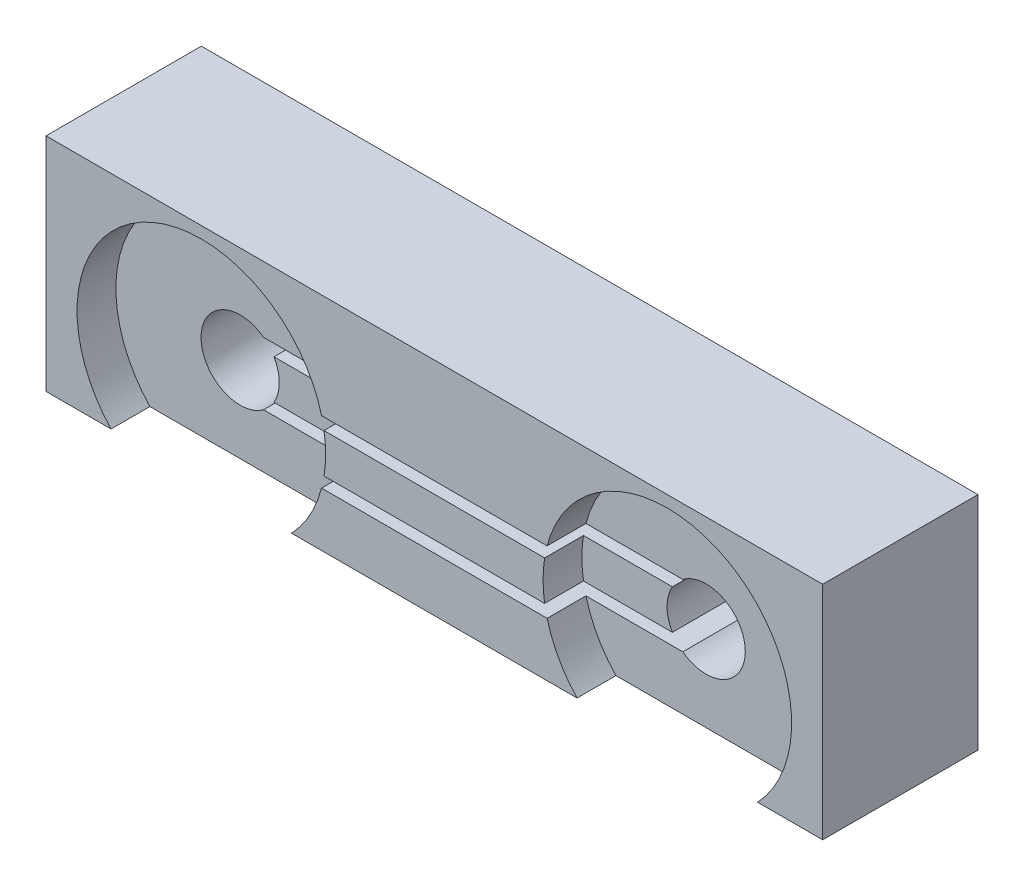
ISO-10303-21;
HEADER;
FILE_DESCRIPTION(('STEP AP214'),'2;1');
FILE_NAME('part.step','',(''),(''),'','','');
FILE_SCHEMA(('AUTOMOTIVE_DESIGN { 1 0 10303 214 1 1 1 1 }'));
ENDSEC;
DATA;
#1=APPLICATION_CONTEXT('core data for automotive mechanical design processes');
#2=APPLICATION_PROTOCOL_DEFINITION('international standard','automotive_design',2000,#1);
#3=PRODUCT_CONTEXT('',#1,'mechanical');
#4=PRODUCT('Part','Part','',(#3));
#5=PRODUCT_RELATED_PRODUCT_CATEGORY('part','',(#4));
#6=PRODUCT_DEFINITION_FORMATION('','',#4);
#7=PRODUCT_DEFINITION_CONTEXT('part definition',#1,'design');
#8=PRODUCT_DEFINITION('design','',#6,#7);
#9=PRODUCT_DEFINITION_SHAPE('','',#8);
#10=(LENGTH_UNIT() NAMED_UNIT(*) SI_UNIT(.MILLI.,.METRE.));
#11=(NAMED_UNIT(*) PLANE_ANGLE_UNIT() SI_UNIT($,.RADIAN.));
#12=(NAMED_UNIT(*) SI_UNIT($,.STERADIAN.) SOLID_ANGLE_UNIT());
#13=UNCERTAINTY_MEASURE_WITH_UNIT(LENGTH_MEASURE(1.E-05),#10,'distance_accuracy_value','');
#14=(GEOMETRIC_REPRESENTATION_CONTEXT(3) GLOBAL_UNCERTAINTY_ASSIGNED_CONTEXT((#13)) GLOBAL_UNIT_ASSIGNED_CONTEXT((#10,
#11,#12)) REPRESENTATION_CONTEXT('',''));
#15=CARTESIAN_POINT('',(0.,0.,0.));
#16=DIRECTION('',(0.,0.,1.));
#17=DIRECTION('',(1.,0.,0.));
#18=AXIS2_PLACEMENT_3D('',#15,#16,#17);
#19=CARTESIAN_POINT('',(0.,0.,40.));
#20=DIRECTION('',(0.,0.,-1.));
#21=DIRECTION('',(-1.,0.,0.));
#22=AXIS2_PLACEMENT_3D('',#19,#20,#21);
#23=PLANE('',#22);
#24=DIRECTION('',(1.,0.,0.));
#25=VECTOR('',#24,1.);
#26=CARTESIAN_POINT('',(-60.,-8.07500000000001,40.));
#27=LINE('',#26,#25);
#28=CARTESIAN_POINT('',(-29.0355950323601,-8.07500000000001,40.));
#29=VERTEX_POINT('',#28);
#30=CARTESIAN_POINT('',(29.0355950323601,-8.07499999999999,40.));
#31=VERTEX_POINT('',#30);
#32=EDGE_CURVE('E220',#29,#31,#27,.T.);
#33=ORIENTED_EDGE('',*,*,#32,.F.);
#34=CARTESIAN_POINT('',(-60.,0.,40.));
#35=DIRECTION('',(0.,0.,1.));
#36=DIRECTION('',(-1.,0.,0.));
#37=AXIS2_PLACEMENT_3D('',#34,#35,#36);
#38=CIRCLE('',#37,32.);
#39=CARTESIAN_POINT('',(-36.7620999227555,-22.,40.));
#40=VERTEX_POINT('',#39);
#41=EDGE_CURVE('E357',#40,#29,#38,.T.);
#42=ORIENTED_EDGE('',*,*,#41,.F.);
#43=DIRECTION('',(-1.,0.,0.));
#44=VECTOR('',#43,1.);
#45=CARTESIAN_POINT('',(-100.,-22.,40.));
#46=LINE('',#45,#44);
#47=CARTESIAN_POINT('',(36.7620999227555,-22.,40.));
#48=VERTEX_POINT('',#47);
#49=EDGE_CURVE('E255',#48,#40,#46,.T.);
#50=ORIENTED_EDGE('',*,*,#49,.F.);
#51=CARTESIAN_POINT('',(60.,0.,40.));
#52=DIRECTION('',(0.,0.,1.));
#53=DIRECTION('',(1.,0.,0.));
#54=AXIS2_PLACEMENT_3D('',#51,#52,#53);
#55=CIRCLE('',#54,32.);
#56=EDGE_CURVE('E322',#31,#48,#55,.T.);
#57=ORIENTED_EDGE('',*,*,#56,.F.);
#58=EDGE_LOOP('',(#33,#42,#50,#57));
#59=FACE_BOUND('',#58,.T.);
#60=ADVANCED_FACE('F36',(#59),#23,.F.);
#61=CARTESIAN_POINT('',(60.,0.,30.));
#62=DIRECTION('',(0.,0.,1.));
#63=DIRECTION('',(1.,0.,0.));
#64=AXIS2_PLACEMENT_3D('',#61,#62,#63);
#65=PLANE('',#64);
#66=CARTESIAN_POINT('',(60.,0.,30.));
#67=DIRECTION('',(0.,0.,1.));
#68=DIRECTION('',(1.,0.,0.));
#69=AXIS2_PLACEMENT_3D('',#66,#67,#68);
#70=CIRCLE('',#69,10.075);
#71=CARTESIAN_POINT('',(53.9750518674431,-8.07499999999999,30.));
#72=VERTEX_POINT('',#71);
#73=CARTESIAN_POINT('',(53.9750518674432,8.075,30.));
#74=VERTEX_POINT('',#73);
#75=EDGE_CURVE('E701',#72,#74,#70,.T.);
#76=ORIENTED_EDGE('',*,*,#75,.F.);
#77=DIRECTION('',(1.,0.,0.));
#78=VECTOR('',#77,1.);
#79=CARTESIAN_POINT('',(60.,-8.07499999999999,30.));
#80=LINE('',#79,#78);
#81=CARTESIAN_POINT('',(29.0355950323601,-8.07499999999999,30.));
#82=VERTEX_POINT('',#81);
#83=EDGE_CURVE('E218',#82,#72,#80,.T.);
#84=ORIENTED_EDGE('',*,*,#83,.F.);
#85=CARTESIAN_POINT('',(60.,0.,30.));
#86=DIRECTION('',(0.,0.,-1.));
#87=DIRECTION('',(-1.,0.,0.));
#88=AXIS2_PLACEMENT_3D('',#85,#86,#87);
#89=CIRCLE('',#88,32.);
#90=CARTESIAN_POINT('',(36.7620999227555,-22.,30.));
#91=VERTEX_POINT('',#90);
#92=EDGE_CURVE('E320',#82,#91,#89,.F.);
#93=ORIENTED_EDGE('',*,*,#92,.T.);
#94=DIRECTION('',(1.,0.,0.));
#95=VECTOR('',#94,1.);
#96=CARTESIAN_POINT('',(-100.,-22.,30.));
#97=LINE('',#96,#95);
#98=CARTESIAN_POINT('',(83.2379000772445,-22.,30.));
#99=VERTEX_POINT('',#98);
#100=EDGE_CURVE('E262',#91,#99,#97,.T.);
#101=ORIENTED_EDGE('',*,*,#100,.T.);
#102=CARTESIAN_POINT('',(29.0355950323601,8.075,30.));
#103=VERTEX_POINT('',#102);
#104=EDGE_CURVE('E317',#99,#103,#89,.F.);
#105=ORIENTED_EDGE('',*,*,#104,.T.);
#106=DIRECTION('',(-1.,0.,0.));
#107=VECTOR('',#106,1.);
#108=CARTESIAN_POINT('',(60.,8.075,30.));
#109=LINE('',#108,#107);
#110=EDGE_CURVE('E239',#74,#103,#109,.T.);
#111=ORIENTED_EDGE('',*,*,#110,.F.);
#112=EDGE_LOOP('',(#76,#84,#93,#101,#105,#111));
#113=FACE_BOUND('',#112,.T.);
#114=ADVANCED_FACE('F426',(#113),#65,.T.);
#115=CARTESIAN_POINT('',(-60.,0.,30.));
#116=DIRECTION('',(0.,0.,-1.));
#117=DIRECTION('',(-1.,0.,0.));
#118=AXIS2_PLACEMENT_3D('',#115,#116,#117);
#119=PLANE('',#118);
#120=DIRECTION('',(-1.,0.,0.));
#121=VECTOR('',#120,1.);
#122=CARTESIAN_POINT('',(-60.,-8.07500000000001,30.));
#123=LINE('',#122,#121);
#124=CARTESIAN_POINT('',(-29.0355950323601,-8.07500000000001,30.));
#125=VERTEX_POINT('',#124);
#126=CARTESIAN_POINT('',(-53.9750518674432,-8.07500000000001,30.));
#127=VERTEX_POINT('',#126);
#128=EDGE_CURVE('E297',#125,#127,#123,.T.);
#129=ORIENTED_EDGE('',*,*,#128,.T.);
#130=CARTESIAN_POINT('',(-60.,0.,30.));
#131=DIRECTION('',(0.,0.,1.));
#132=DIRECTION('',(-1.,0.,0.));
#133=AXIS2_PLACEMENT_3D('',#130,#131,#132);
#134=CIRCLE('',#133,10.075);
#135=CARTESIAN_POINT('',(-53.9750518674432,8.075,30.));
#136=VERTEX_POINT('',#135);
#137=EDGE_CURVE('E686',#136,#127,#134,.T.);
#138=ORIENTED_EDGE('',*,*,#137,.F.);
#139=DIRECTION('',(1.,0.,0.));
#140=VECTOR('',#139,1.);
#141=CARTESIAN_POINT('',(-60.,8.075,30.));
#142=LINE('',#141,#140);
#143=CARTESIAN_POINT('',(-29.0355950323601,8.075,30.));
#144=VERTEX_POINT('',#143);
#145=EDGE_CURVE('E237',#136,#144,#142,.T.);
#146=ORIENTED_EDGE('',*,*,#145,.T.);
#147=CARTESIAN_POINT('',(-60.,0.,30.));
#148=DIRECTION('',(0.,0.,-1.));
#149=DIRECTION('',(-1.,0.,0.));
#150=AXIS2_PLACEMENT_3D('',#147,#148,#149);
#151=CIRCLE('',#150,32.);
#152=CARTESIAN_POINT('',(-83.2379000772445,-22.,30.));
#153=VERTEX_POINT('',#152);
#154=EDGE_CURVE('E360',#144,#153,#151,.F.);
#155=ORIENTED_EDGE('',*,*,#154,.T.);
#156=DIRECTION('',(-1.,0.,0.));
#157=VECTOR('',#156,1.);
#158=CARTESIAN_POINT('',(-100.,-22.,30.));
#159=LINE('',#158,#157);
#160=CARTESIAN_POINT('',(-36.7620999227555,-22.,30.));
#161=VERTEX_POINT('',#160);
#162=EDGE_CURVE('E259',#161,#153,#159,.T.);
#163=ORIENTED_EDGE('',*,*,#162,.F.);
#164=EDGE_CURVE('E368',#161,#125,#151,.F.);
#165=ORIENTED_EDGE('',*,*,#164,.T.);
#166=EDGE_LOOP('',(#129,#138,#146,#155,#163,#165));
#167=FACE_BOUND('',#166,.T.);
#168=ADVANCED_FACE('F431',(#167),#119,.F.);
#169=DIRECTION('',(1.,0.,0.));
#170=VECTOR('',#169,1.);
#171=CARTESIAN_POINT('',(-60.,5.075,40.));
#172=LINE('',#171,#170);
#173=CARTESIAN_POINT('',(-28.4049944611494,5.075,40.));
#174=VERTEX_POINT('',#173);
#175=CARTESIAN_POINT('',(28.4049944611494,5.075,40.));
#176=VERTEX_POINT('',#175);
#177=EDGE_CURVE('E228',#174,#176,#172,.T.);
#178=ORIENTED_EDGE('',*,*,#177,.F.);
#179=CARTESIAN_POINT('',(-28.4049944611494,-5.07500000000001,40.));
#180=VERTEX_POINT('',#179);
#181=EDGE_CURVE('E353',#180,#174,#38,.T.);
#182=ORIENTED_EDGE('',*,*,#181,.F.);
#183=DIRECTION('',(-1.,0.,0.));
#184=VECTOR('',#183,1.);
#185=CARTESIAN_POINT('',(-60.,-5.07500000000001,40.));
#186=LINE('',#185,#184);
#187=CARTESIAN_POINT('',(28.4049944611494,-5.07499999999999,40.));
#188=VERTEX_POINT('',#187);
#189=EDGE_CURVE('E223',#188,#180,#186,.T.);
#190=ORIENTED_EDGE('',*,*,#189,.F.);
#191=EDGE_CURVE('E318',#176,#188,#55,.T.);
#192=ORIENTED_EDGE('',*,*,#191,.F.);
#193=EDGE_LOOP('',(#178,#182,#190,#192));
#194=FACE_BOUND('',#193,.T.);
#195=ADVANCED_FACE('F352',(#194),#23,.F.);
#196=CARTESIAN_POINT('',(60.,0.,-0.001000000000001));
#197=DIRECTION('',(0.,0.,1.));
#198=DIRECTION('',(1.,0.,0.));
#199=AXIS2_PLACEMENT_3D('',#196,#197,#198);
#200=CYLINDRICAL_SURFACE('',#199,2.75000000000001);
#201=CARTESIAN_POINT('',(60.,0.,0.));
#202=DIRECTION('',(0.,0.,-1.));
#203=DIRECTION('',(-1.,0.,0.));
#204=AXIS2_PLACEMENT_3D('',#201,#202,#203);
#205=CIRCLE('',#204,2.75000000000001);
#206=CARTESIAN_POINT('',(57.25,0.,0.));
#207=VERTEX_POINT('',#206);
#208=EDGE_CURVE('E268',#207,#207,#205,.F.);
#209=ORIENTED_EDGE('',*,*,#208,.F.);
#210=EDGE_LOOP('',(#209));
#211=FACE_BOUND('',#210,.T.);
#212=CARTESIAN_POINT('',(60.,0.,10.));
#213=DIRECTION('',(0.,0.,1.));
#214=DIRECTION('',(1.,0.,0.));
#215=AXIS2_PLACEMENT_3D('',#212,#213,#214);
#216=CIRCLE('',#215,2.75000000000001);
#217=CARTESIAN_POINT('',(62.75,0.,10.));
#218=VERTEX_POINT('',#217);
#219=EDGE_CURVE('E269',#218,#218,#216,.F.);
#220=ORIENTED_EDGE('',*,*,#219,.F.);
#221=EDGE_LOOP('',(#220));
#222=FACE_BOUND('',#221,.T.);
#223=ADVANCED_FACE('F418',(#211,#222),#200,.F.);
#224=CARTESIAN_POINT('',(100.,-35.,40.));
#225=DIRECTION('',(-1.,0.,0.));
#226=DIRECTION('',(0.,0.,1.));
#227=AXIS2_PLACEMENT_3D('',#224,#225,#226);
#228=PLANE('',#227);
#229=DIRECTION('',(0.,1.,0.));
#230=VECTOR('',#229,1.);
#231=CARTESIAN_POINT('',(100.,-35.,40.));
#232=LINE('',#231,#230);
#233=CARTESIAN_POINT('',(100.,-22.,40.));
#234=VERTEX_POINT('',#233);
#235=CARTESIAN_POINT('',(100.,35.,40.));
#236=VERTEX_POINT('',#235);
#237=EDGE_CURVE('E273',#234,#236,#232,.T.);
#238=ORIENTED_EDGE('',*,*,#237,.F.);
#239=DIRECTION('',(0.,0.,1.));
#240=VECTOR('',#239,1.);
#241=CARTESIAN_POINT('',(100.,-22.,-0.001000000000001));
#242=LINE('',#241,#240);
#243=CARTESIAN_POINT('',(100.,-22.,0.));
#244=VERTEX_POINT('',#243);
#245=EDGE_CURVE('E254',#244,#234,#242,.T.);
#246=ORIENTED_EDGE('',*,*,#245,.F.);
#247=DIRECTION('',(0.,1.,0.));
#248=VECTOR('',#247,1.);
#249=CARTESIAN_POINT('',(100.,-35.,0.));
#250=LINE('',#249,#248);
#251=CARTESIAN_POINT('',(100.,35.,0.));
#252=VERTEX_POINT('',#251);
#253=EDGE_CURVE('E272',#244,#252,#250,.T.);
#254=ORIENTED_EDGE('',*,*,#253,.T.);
#255=DIRECTION('',(0.,0.,-1.));
#256=VECTOR('',#255,1.);
#257=CARTESIAN_POINT('',(100.,35.,40.));
#258=LINE('',#257,#256);
#259=EDGE_CURVE('E289',#236,#252,#258,.T.);
#260=ORIENTED_EDGE('',*,*,#259,.F.);
#261=EDGE_LOOP('',(#238,#246,#254,#260));
#262=FACE_BOUND('',#261,.T.);
#263=ADVANCED_FACE('F38',(#262),#228,.F.);
#264=CARTESIAN_POINT('',(-100.,35.,40.));
#265=DIRECTION('',(0.,-1.,0.));
#266=DIRECTION('',(0.,0.,-1.));
#267=AXIS2_PLACEMENT_3D('',#264,#265,#266);
#268=PLANE('',#267);
#269=DIRECTION('',(-1.,0.,0.));
#270=VECTOR('',#269,1.);
#271=CARTESIAN_POINT('',(-100.,35.,0.));
#272=LINE('',#271,#270);
#273=CARTESIAN_POINT('',(-100.,35.,0.));
#274=VERTEX_POINT('',#273);
#275=EDGE_CURVE('E283',#252,#274,#272,.T.);
#276=ORIENTED_EDGE('',*,*,#275,.T.);
#277=DIRECTION('',(0.,0.,-1.));
#278=VECTOR('',#277,1.);
#279=CARTESIAN_POINT('',(-100.,35.,40.));
#280=LINE('',#279,#278);
#281=CARTESIAN_POINT('',(-100.,35.,40.));
#282=VERTEX_POINT('',#281);
#283=EDGE_CURVE('E281',#282,#274,#280,.T.);
#284=ORIENTED_EDGE('',*,*,#283,.F.);
#285=DIRECTION('',(-1.,0.,0.));
#286=VECTOR('',#285,1.);
#287=CARTESIAN_POINT('',(-100.,35.,40.));
#288=LINE('',#287,#286);
#289=EDGE_CURVE('E275',#236,#282,#288,.T.);
#290=ORIENTED_EDGE('',*,*,#289,.F.);
#291=ORIENTED_EDGE('',*,*,#259,.T.);
#292=EDGE_LOOP('',(#276,#284,#290,#291));
#293=FACE_BOUND('',#292,.T.);
#294=ADVANCED_FACE('F409',(#293),#268,.F.);
#295=CARTESIAN_POINT('',(-100.,-35.,40.));
#296=DIRECTION('',(1.,0.,0.));
#297=DIRECTION('',(0.,0.,-1.));
#298=AXIS2_PLACEMENT_3D('',#295,#296,#297);
#299=PLANE('',#298);
#300=DIRECTION('',(0.,-1.,0.));
#301=VECTOR('',#300,1.);
#302=CARTESIAN_POINT('',(-100.,-35.,0.));
#303=LINE('',#302,#301);
#304=CARTESIAN_POINT('',(-100.,-22.,0.));
#305=VERTEX_POINT('',#304);
#306=EDGE_CURVE('E276',#274,#305,#303,.T.);
#307=ORIENTED_EDGE('',*,*,#306,.T.);
#308=DIRECTION('',(0.,0.,1.));
#309=VECTOR('',#308,1.);
#310=CARTESIAN_POINT('',(-100.,-22.,-0.001000000000001));
#311=LINE('',#310,#309);
#312=CARTESIAN_POINT('',(-100.,-22.,40.));
#313=VERTEX_POINT('',#312);
#314=EDGE_CURVE('E256',#305,#313,#311,.T.);
#315=ORIENTED_EDGE('',*,*,#314,.T.);
#316=DIRECTION('',(0.,-1.,0.));
#317=VECTOR('',#316,1.);
#318=CARTESIAN_POINT('',(-100.,-35.,40.));
#319=LINE('',#318,#317);
#320=EDGE_CURVE('E278',#282,#313,#319,.T.);
#321=ORIENTED_EDGE('',*,*,#320,.F.);
#322=ORIENTED_EDGE('',*,*,#283,.T.);
#323=EDGE_LOOP('',(#307,#315,#321,#322));
#324=FACE_BOUND('',#323,.T.);
#325=ADVANCED_FACE('F400',(#324),#299,.F.);
#326=CARTESIAN_POINT('',(-83.2379000772445,-22.,40.));
#327=VERTEX_POINT('',#326);
#328=EDGE_CURVE('E250',#327,#313,#46,.T.);
#329=ORIENTED_EDGE('',*,*,#328,.F.);
#330=CARTESIAN_POINT('',(-29.0355950323601,8.075,40.));
#331=VERTEX_POINT('',#330);
#332=EDGE_CURVE('E358',#331,#327,#38,.T.);
#333=ORIENTED_EDGE('',*,*,#332,.F.);
#334=DIRECTION('',(-1.,0.,0.));
#335=VECTOR('',#334,1.);
#336=CARTESIAN_POINT('',(-60.,8.075,40.));
#337=LINE('',#336,#335);
#338=CARTESIAN_POINT('',(29.0355950323601,8.075,40.));
#339=VERTEX_POINT('',#338);
#340=EDGE_CURVE('E229',#339,#331,#337,.T.);
#341=ORIENTED_EDGE('',*,*,#340,.F.);
#342=CARTESIAN_POINT('',(83.2379000772445,-22.,40.));
#343=VERTEX_POINT('',#342);
#344=EDGE_CURVE('E324',#343,#339,#55,.T.);
#345=ORIENTED_EDGE('',*,*,#344,.F.);
#346=EDGE_CURVE('E251',#234,#343,#46,.T.);
#347=ORIENTED_EDGE('',*,*,#346,.F.);
#348=ORIENTED_EDGE('',*,*,#237,.T.);
#349=ORIENTED_EDGE('',*,*,#289,.T.);
#350=ORIENTED_EDGE('',*,*,#320,.T.);
#351=EDGE_LOOP('',(#329,#333,#341,#345,#347,#348,#349,#350));
#352=FACE_BOUND('',#351,.T.);
#353=ADVANCED_FACE('F402',(#352),#23,.F.);
#354=CARTESIAN_POINT('',(0.,0.,0.));
#355=DIRECTION('',(0.,0.,-1.));
#356=DIRECTION('',(-1.,0.,0.));
#357=AXIS2_PLACEMENT_3D('',#354,#355,#356);
#358=PLANE('',#357);
#359=DIRECTION('',(-1.,0.,0.));
#360=VECTOR('',#359,1.);
#361=CARTESIAN_POINT('',(-100.,-22.,0.));
#362=LINE('',#361,#360);
#363=EDGE_CURVE('E247',#244,#305,#362,.T.);
#364=ORIENTED_EDGE('',*,*,#363,.T.);
#365=ORIENTED_EDGE('',*,*,#306,.F.);
#366=ORIENTED_EDGE('',*,*,#275,.F.);
#367=ORIENTED_EDGE('',*,*,#253,.F.);
#368=EDGE_LOOP('',(#364,#365,#366,#367));
#369=FACE_BOUND('',#368,.T.);
#370=CARTESIAN_POINT('',(-60.,0.,0.));
#371=DIRECTION('',(0.,0.,-1.));
#372=DIRECTION('',(-1.,0.,0.));
#373=AXIS2_PLACEMENT_3D('',#370,#371,#372);
#374=CIRCLE('',#373,2.75);
#375=CARTESIAN_POINT('',(-62.75,0.,0.));
#376=VERTEX_POINT('',#375);
#377=EDGE_CURVE('E265',#376,#376,#374,.F.);
#378=ORIENTED_EDGE('',*,*,#377,.T.);
#379=EDGE_LOOP('',(#378));
#380=FACE_BOUND('',#379,.T.);
#381=ORIENTED_EDGE('',*,*,#208,.T.);
#382=EDGE_LOOP('',(#381));
#383=FACE_BOUND('',#382,.T.);
#384=ADVANCED_FACE('F412',(#369,#380,#383),#358,.T.);
#385=CARTESIAN_POINT('',(-60.,0.,-0.001000000000001));
#386=DIRECTION('',(0.,0.,1.));
#387=DIRECTION('',(1.,0.,0.));
#388=AXIS2_PLACEMENT_3D('',#385,#386,#387);
#389=CYLINDRICAL_SURFACE('',#388,2.75);
#390=CARTESIAN_POINT('',(-60.,0.,10.));
#391=DIRECTION('',(0.,0.,-1.));
#392=DIRECTION('',(-1.,0.,0.));
#393=AXIS2_PLACEMENT_3D('',#390,#391,#392);
#394=CIRCLE('',#393,2.75);
#395=CARTESIAN_POINT('',(-62.75,0.,10.));
#396=VERTEX_POINT('',#395);
#397=EDGE_CURVE('E264',#396,#396,#394,.F.);
#398=ORIENTED_EDGE('',*,*,#397,.T.);
#399=EDGE_LOOP('',(#398));
#400=FACE_BOUND('',#399,.T.);
#401=ORIENTED_EDGE('',*,*,#377,.F.);
#402=EDGE_LOOP('',(#401));
#403=FACE_BOUND('',#402,.T.);
#404=ADVANCED_FACE('F440',(#400,#403),#389,.F.);
#405=CARTESIAN_POINT('',(60.,0.,10.));
#406=DIRECTION('',(0.,0.,1.));
#407=DIRECTION('',(1.,0.,0.));
#408=AXIS2_PLACEMENT_3D('',#405,#406,#407);
#409=PLANE('',#408);
#410=DIRECTION('',(-1.,0.,0.));
#411=VECTOR('',#410,1.);
#412=CARTESIAN_POINT('',(-60.,8.075,10.));
#413=LINE('',#412,#411);
#414=CARTESIAN_POINT('',(53.9750518674432,8.075,10.));
#415=VERTEX_POINT('',#414);
#416=CARTESIAN_POINT('',(-53.9750518674432,8.075,10.));
#417=VERTEX_POINT('',#416);
#418=EDGE_CURVE('E235',#415,#417,#413,.T.);
#419=ORIENTED_EDGE('',*,*,#418,.T.);
#420=CARTESIAN_POINT('',(-60.,0.,10.));
#421=DIRECTION('',(0.,0.,1.));
#422=DIRECTION('',(1.,0.,0.));
#423=AXIS2_PLACEMENT_3D('',#420,#421,#422);
#424=CIRCLE('',#423,10.075);
#425=CARTESIAN_POINT('',(-53.9750518674432,-8.07500000000001,10.));
#426=VERTEX_POINT('',#425);
#427=EDGE_CURVE('E51',#426,#417,#424,.F.);
#428=ORIENTED_EDGE('',*,*,#427,.F.);
#429=DIRECTION('',(1.,0.,0.));
#430=VECTOR('',#429,1.);
#431=CARTESIAN_POINT('',(-60.,-8.07500000000001,10.));
#432=LINE('',#431,#430);
#433=CARTESIAN_POINT('',(53.9750518674431,-8.07499999999999,10.));
#434=VERTEX_POINT('',#433);
#435=EDGE_CURVE('E216',#426,#434,#432,.T.);
#436=ORIENTED_EDGE('',*,*,#435,.T.);
#437=CARTESIAN_POINT('',(60.,0.,10.));
#438=DIRECTION('',(0.,0.,1.));
#439=DIRECTION('',(1.,0.,0.));
#440=AXIS2_PLACEMENT_3D('',#437,#438,#439);
#441=CIRCLE('',#440,10.075);
#442=EDGE_CURVE('E711',#415,#434,#441,.F.);
#443=ORIENTED_EDGE('',*,*,#442,.F.);
#444=EDGE_LOOP('',(#419,#428,#436,#443));
#445=FACE_BOUND('',#444,.T.);
#446=CARTESIAN_POINT('',(-51.2965524072354,5.075,10.));
#447=VERTEX_POINT('',#446);
#448=CARTESIAN_POINT('',(-51.2965524072354,-5.07500000000001,10.));
#449=VERTEX_POINT('',#448);
#450=EDGE_CURVE('E197',#447,#449,#424,.F.);
#451=ORIENTED_EDGE('',*,*,#450,.F.);
#452=DIRECTION('',(1.,0.,0.));
#453=VECTOR('',#452,1.);
#454=CARTESIAN_POINT('',(-60.,5.075,10.));
#455=LINE('',#454,#453);
#456=CARTESIAN_POINT('',(51.2965524072354,5.075,10.));
#457=VERTEX_POINT('',#456);
#458=EDGE_CURVE('E232',#447,#457,#455,.T.);
#459=ORIENTED_EDGE('',*,*,#458,.T.);
#460=CARTESIAN_POINT('',(51.2965524072354,-5.07499999999999,10.));
#461=VERTEX_POINT('',#460);
#462=EDGE_CURVE('E59',#461,#457,#441,.F.);
#463=ORIENTED_EDGE('',*,*,#462,.F.);
#464=DIRECTION('',(-1.,0.,0.));
#465=VECTOR('',#464,1.);
#466=CARTESIAN_POINT('',(-60.,-5.07500000000001,10.));
#467=LINE('',#466,#465);
#468=EDGE_CURVE('E210',#461,#449,#467,.T.);
#469=ORIENTED_EDGE('',*,*,#468,.T.);
#470=EDGE_LOOP('',(#451,#459,#463,#469));
#471=FACE_BOUND('',#470,.T.);
#472=ORIENTED_EDGE('',*,*,#219,.T.);
#473=EDGE_LOOP('',(#472));
#474=FACE_BOUND('',#473,.T.);
#475=ORIENTED_EDGE('',*,*,#397,.F.);
#476=EDGE_LOOP('',(#475));
#477=FACE_BOUND('',#476,.T.);
#478=ADVANCED_FACE('F213',(#445,#471,#474,#477),#409,.T.);
#479=CARTESIAN_POINT('',(51.2965524072354,5.075,30.));
#480=VERTEX_POINT('',#479);
#481=CARTESIAN_POINT('',(51.2965524072354,-5.07499999999999,30.));
#482=VERTEX_POINT('',#481);
#483=EDGE_CURVE('E311',#480,#482,#70,.T.);
#484=ORIENTED_EDGE('',*,*,#483,.F.);
#485=DIRECTION('',(1.,0.,0.));
#486=VECTOR('',#485,1.);
#487=CARTESIAN_POINT('',(60.,5.075,30.));
#488=LINE('',#487,#486);
#489=CARTESIAN_POINT('',(28.4049944611494,5.075,30.));
#490=VERTEX_POINT('',#489);
#491=EDGE_CURVE('E244',#490,#480,#488,.T.);
#492=ORIENTED_EDGE('',*,*,#491,.F.);
#493=CARTESIAN_POINT('',(28.4049944611494,-5.07499999999999,30.));
#494=VERTEX_POINT('',#493);
#495=EDGE_CURVE('E313',#490,#494,#89,.F.);
#496=ORIENTED_EDGE('',*,*,#495,.T.);
#497=DIRECTION('',(-1.,0.,0.));
#498=VECTOR('',#497,1.);
#499=CARTESIAN_POINT('',(60.,-5.07499999999999,30.));
#500=LINE('',#499,#498);
#501=EDGE_CURVE('E215',#482,#494,#500,.T.);
#502=ORIENTED_EDGE('',*,*,#501,.F.);
#503=EDGE_LOOP('',(#484,#492,#496,#502));
#504=FACE_BOUND('',#503,.T.);
#505=ADVANCED_FACE('F310',(#504),#65,.T.);
#506=DIRECTION('',(-1.,0.,0.));
#507=VECTOR('',#506,1.);
#508=CARTESIAN_POINT('',(-60.,5.075,30.));
#509=LINE('',#508,#507);
#510=CARTESIAN_POINT('',(-28.4049944611494,5.075,30.));
#511=VERTEX_POINT('',#510);
#512=CARTESIAN_POINT('',(-51.2965524072354,5.075,30.));
#513=VERTEX_POINT('',#512);
#514=EDGE_CURVE('E241',#511,#513,#509,.T.);
#515=ORIENTED_EDGE('',*,*,#514,.T.);
#516=CARTESIAN_POINT('',(-51.2965524072354,-5.07500000000001,30.));
#517=VERTEX_POINT('',#516);
#518=EDGE_CURVE('E203',#517,#513,#134,.T.);
#519=ORIENTED_EDGE('',*,*,#518,.F.);
#520=DIRECTION('',(1.,0.,0.));
#521=VECTOR('',#520,1.);
#522=CARTESIAN_POINT('',(-60.,-5.07500000000001,30.));
#523=LINE('',#522,#521);
#524=CARTESIAN_POINT('',(-28.4049944611494,-5.07500000000001,30.));
#525=VERTEX_POINT('',#524);
#526=EDGE_CURVE('E212',#517,#525,#523,.T.);
#527=ORIENTED_EDGE('',*,*,#526,.T.);
#528=EDGE_CURVE('E367',#525,#511,#151,.F.);
#529=ORIENTED_EDGE('',*,*,#528,.T.);
#530=EDGE_LOOP('',(#515,#519,#527,#529));
#531=FACE_BOUND('',#530,.T.);
#532=ADVANCED_FACE('F486',(#531),#119,.F.);
#533=CARTESIAN_POINT('',(-100.,-22.,-0.001000000000001));
#534=DIRECTION('',(0.,1.,0.));
#535=DIRECTION('',(0.,0.,1.));
#536=AXIS2_PLACEMENT_3D('',#533,#534,#535);
#537=PLANE('',#536);
#538=ORIENTED_EDGE('',*,*,#162,.T.);
#539=DIRECTION('',(0.,0.,1.));
#540=VECTOR('',#539,1.);
#541=CARTESIAN_POINT('',(-83.2379000772445,-22.,-60.5096679918782));
#542=LINE('',#541,#540);
#543=EDGE_CURVE('E379',#153,#327,#542,.T.);
#544=ORIENTED_EDGE('',*,*,#543,.T.);
#545=ORIENTED_EDGE('',*,*,#328,.T.);
#546=ORIENTED_EDGE('',*,*,#314,.F.);
#547=ORIENTED_EDGE('',*,*,#363,.F.);
#548=ORIENTED_EDGE('',*,*,#245,.T.);
#549=ORIENTED_EDGE('',*,*,#346,.T.);
#550=DIRECTION('',(0.,0.,1.));
#551=VECTOR('',#550,1.);
#552=CARTESIAN_POINT('',(83.2379000772445,-22.,-60.5096679918782));
#553=LINE('',#552,#551);
#554=EDGE_CURVE('E339',#343,#99,#553,.F.);
#555=ORIENTED_EDGE('',*,*,#554,.T.);
#556=ORIENTED_EDGE('',*,*,#100,.F.);
#557=DIRECTION('',(0.,0.,1.));
#558=VECTOR('',#557,1.);
#559=CARTESIAN_POINT('',(36.7620999227555,-22.,-60.5096679918782));
#560=LINE('',#559,#558);
#561=EDGE_CURVE('E342',#91,#48,#560,.T.);
#562=ORIENTED_EDGE('',*,*,#561,.T.);
#563=ORIENTED_EDGE('',*,*,#49,.T.);
#564=DIRECTION('',(0.,0.,1.));
#565=VECTOR('',#564,1.);
#566=CARTESIAN_POINT('',(-36.7620999227555,-22.,-60.5096679918782));
#567=LINE('',#566,#565);
#568=EDGE_CURVE('E376',#40,#161,#567,.F.);
#569=ORIENTED_EDGE('',*,*,#568,.T.);
#570=EDGE_LOOP('',(#538,#544,#545,#546,#547,#548,#549,#555,#556,#562,#563,#569));
#571=FACE_BOUND('',#570,.T.);
#572=ADVANCED_FACE('F392',(#571),#537,.F.);
#573=CARTESIAN_POINT('',(-60.,5.075,-110.037494142455));
#574=DIRECTION('',(0.,-1.,0.));
#575=DIRECTION('',(0.,0.,-1.));
#576=AXIS2_PLACEMENT_3D('',#573,#574,#575);
#577=PLANE('',#576);
#578=ORIENTED_EDGE('',*,*,#458,.F.);
#579=DIRECTION('',(0.,0.,1.));
#580=VECTOR('',#579,1.);
#581=CARTESIAN_POINT('',(-51.2965524072354,5.075,-18.4964032818179));
#582=LINE('',#581,#580);
#583=EDGE_CURVE('E201',#447,#513,#582,.T.);
#584=ORIENTED_EDGE('',*,*,#583,.T.);
#585=ORIENTED_EDGE('',*,*,#514,.F.);
#586=DIRECTION('',(0.,0.,1.));
#587=VECTOR('',#586,1.);
#588=CARTESIAN_POINT('',(-28.4049944611494,5.075,-60.5096679918782));
#589=LINE('',#588,#587);
#590=EDGE_CURVE('E374',#511,#174,#589,.T.);
#591=ORIENTED_EDGE('',*,*,#590,.T.);
#592=ORIENTED_EDGE('',*,*,#177,.T.);
#593=DIRECTION('',(0.,0.,1.));
#594=VECTOR('',#593,1.);
#595=CARTESIAN_POINT('',(28.4049944611494,5.075,-60.5096679918782));
#596=LINE('',#595,#594);
#597=EDGE_CURVE('E335',#176,#490,#596,.F.);
#598=ORIENTED_EDGE('',*,*,#597,.T.);
#599=ORIENTED_EDGE('',*,*,#491,.T.);
#600=DIRECTION('',(0.,0.,1.));
#601=VECTOR('',#600,1.);
#602=CARTESIAN_POINT('',(51.2965524072354,5.075,-18.4964032818179));
#603=LINE('',#602,#601);
#604=EDGE_CURVE('E361',#480,#457,#603,.F.);
#605=ORIENTED_EDGE('',*,*,#604,.T.);
#606=EDGE_LOOP('',(#578,#584,#585,#591,#592,#598,#599,#605));
#607=FACE_BOUND('',#606,.T.);
#608=ADVANCED_FACE('F500',(#607),#577,.F.);
#609=CARTESIAN_POINT('',(-60.,8.075,-110.037494142455));
#610=DIRECTION('',(0.,1.,0.));
#611=DIRECTION('',(0.,0.,1.));
#612=AXIS2_PLACEMENT_3D('',#609,#610,#611);
#613=PLANE('',#612);
#614=ORIENTED_EDGE('',*,*,#145,.F.);
#615=DIRECTION('',(0.,0.,1.));
#616=VECTOR('',#615,1.);
#617=CARTESIAN_POINT('',(-53.9750518674432,8.075,-18.4964032818179));
#618=LINE('',#617,#616);
#619=EDGE_CURVE('E696',#136,#417,#618,.F.);
#620=ORIENTED_EDGE('',*,*,#619,.T.);
#621=ORIENTED_EDGE('',*,*,#418,.F.);
#622=DIRECTION('',(0.,0.,1.));
#623=VECTOR('',#622,1.);
#624=CARTESIAN_POINT('',(53.9750518674432,8.075,-18.4964032818179));
#625=LINE('',#624,#623);
#626=EDGE_CURVE('E703',#415,#74,#625,.T.);
#627=ORIENTED_EDGE('',*,*,#626,.T.);
#628=ORIENTED_EDGE('',*,*,#110,.T.);
#629=DIRECTION('',(0.,0.,1.));
#630=VECTOR('',#629,1.);
#631=CARTESIAN_POINT('',(29.0355950323601,8.075,-60.5096679918782));
#632=LINE('',#631,#630);
#633=EDGE_CURVE('E331',#103,#339,#632,.T.);
#634=ORIENTED_EDGE('',*,*,#633,.T.);
#635=ORIENTED_EDGE('',*,*,#340,.T.);
#636=DIRECTION('',(0.,0.,1.));
#637=VECTOR('',#636,1.);
#638=CARTESIAN_POINT('',(-29.0355950323601,8.075,-60.5096679918782));
#639=LINE('',#638,#637);
#640=EDGE_CURVE('E371',#331,#144,#639,.F.);
#641=ORIENTED_EDGE('',*,*,#640,.T.);
#642=EDGE_LOOP('',(#614,#620,#621,#627,#628,#634,#635,#641));
#643=FACE_BOUND('',#642,.T.);
#644=ADVANCED_FACE('F507',(#643),#613,.F.);
#645=CARTESIAN_POINT('',(-60.,-8.07500000000001,-110.037494142455));
#646=DIRECTION('',(0.,-1.,0.));
#647=DIRECTION('',(1.,0.,0.));
#648=AXIS2_PLACEMENT_3D('',#645,#646,#647);
#649=PLANE('',#648);
#650=ORIENTED_EDGE('',*,*,#435,.F.);
#651=DIRECTION('',(0.,0.,1.));
#652=VECTOR('',#651,1.);
#653=CARTESIAN_POINT('',(-53.9750518674432,-8.07500000000001,-18.4964032818179));
#654=LINE('',#653,#652);
#655=EDGE_CURVE('E692',#426,#127,#654,.T.);
#656=ORIENTED_EDGE('',*,*,#655,.T.);
#657=ORIENTED_EDGE('',*,*,#128,.F.);
#658=DIRECTION('',(0.,0.,1.));
#659=VECTOR('',#658,1.);
#660=CARTESIAN_POINT('',(-29.0355950323601,-8.07500000000001,-60.5096679918782));
#661=LINE('',#660,#659);
#662=EDGE_CURVE('E369',#125,#29,#661,.T.);
#663=ORIENTED_EDGE('',*,*,#662,.T.);
#664=ORIENTED_EDGE('',*,*,#32,.T.);
#665=DIRECTION('',(0.,0.,1.));
#666=VECTOR('',#665,1.);
#667=CARTESIAN_POINT('',(29.0355950323601,-8.07499999999999,-60.5096679918782));
#668=LINE('',#667,#666);
#669=EDGE_CURVE('E327',#31,#82,#668,.F.);
#670=ORIENTED_EDGE('',*,*,#669,.T.);
#671=ORIENTED_EDGE('',*,*,#83,.T.);
#672=DIRECTION('',(0.,0.,1.));
#673=VECTOR('',#672,1.);
#674=CARTESIAN_POINT('',(53.9750518674431,-8.07499999999999,-18.4964032818179));
#675=LINE('',#674,#673);
#676=EDGE_CURVE('E706',#72,#434,#675,.F.);
#677=ORIENTED_EDGE('',*,*,#676,.T.);
#678=EDGE_LOOP('',(#650,#656,#657,#663,#664,#670,#671,#677));
#679=FACE_BOUND('',#678,.T.);
#680=ADVANCED_FACE('F515',(#679),#649,.F.);
#681=CARTESIAN_POINT('',(-60.,-5.07500000000001,-110.037494142455));
#682=DIRECTION('',(0.,1.,0.));
#683=DIRECTION('',(-1.,0.,0.));
#684=AXIS2_PLACEMENT_3D('',#681,#682,#683);
#685=PLANE('',#684);
#686=ORIENTED_EDGE('',*,*,#526,.F.);
#687=DIRECTION('',(0.,0.,1.));
#688=VECTOR('',#687,1.);
#689=CARTESIAN_POINT('',(-51.2965524072354,-5.07500000000001,-18.4964032818179));
#690=LINE('',#689,#688);
#691=EDGE_CURVE('E12',#517,#449,#690,.F.);
#692=ORIENTED_EDGE('',*,*,#691,.T.);
#693=ORIENTED_EDGE('',*,*,#468,.F.);
#694=DIRECTION('',(0.,0.,1.));
#695=VECTOR('',#694,1.);
#696=CARTESIAN_POINT('',(51.2965524072354,-5.07499999999999,-18.4964032818179));
#697=LINE('',#696,#695);
#698=EDGE_CURVE('E44',#461,#482,#697,.T.);
#699=ORIENTED_EDGE('',*,*,#698,.T.);
#700=ORIENTED_EDGE('',*,*,#501,.T.);
#701=DIRECTION('',(0.,0.,1.));
#702=VECTOR('',#701,1.);
#703=CARTESIAN_POINT('',(28.4049944611494,-5.07499999999999,-60.5096679918782));
#704=LINE('',#703,#702);
#705=EDGE_CURVE('E300',#494,#188,#704,.T.);
#706=ORIENTED_EDGE('',*,*,#705,.T.);
#707=ORIENTED_EDGE('',*,*,#189,.T.);
#708=DIRECTION('',(0.,0.,1.));
#709=VECTOR('',#708,1.);
#710=CARTESIAN_POINT('',(-28.4049944611494,-5.07500000000001,-60.5096679918782));
#711=LINE('',#710,#709);
#712=EDGE_CURVE('E303',#180,#525,#711,.F.);
#713=ORIENTED_EDGE('',*,*,#712,.T.);
#714=EDGE_LOOP('',(#686,#692,#693,#699,#700,#706,#707,#713));
#715=FACE_BOUND('',#714,.T.);
#716=ADVANCED_FACE('F208',(#715),#685,.F.);
#717=CARTESIAN_POINT('',(60.,0.,-60.5096679918782));
#718=DIRECTION('',(0.,0.,1.));
#719=DIRECTION('',(1.,0.,0.));
#720=AXIS2_PLACEMENT_3D('',#717,#718,#719);
#721=CYLINDRICAL_SURFACE('',#720,32.);
#722=ORIENTED_EDGE('',*,*,#191,.T.);
#723=ORIENTED_EDGE('',*,*,#705,.F.);
#724=ORIENTED_EDGE('',*,*,#495,.F.);
#725=ORIENTED_EDGE('',*,*,#597,.F.);
#726=EDGE_LOOP('',(#722,#723,#724,#725));
#727=FACE_BOUND('',#726,.T.);
#728=ADVANCED_FACE('F529',(#727),#721,.F.);
#729=ORIENTED_EDGE('',*,*,#92,.F.);
#730=ORIENTED_EDGE('',*,*,#669,.F.);
#731=ORIENTED_EDGE('',*,*,#56,.T.);
#732=ORIENTED_EDGE('',*,*,#561,.F.);
#733=EDGE_LOOP('',(#729,#730,#731,#732));
#734=FACE_BOUND('',#733,.T.);
#735=ADVANCED_FACE('F387',(#734),#721,.F.);
#736=ORIENTED_EDGE('',*,*,#344,.T.);
#737=ORIENTED_EDGE('',*,*,#633,.F.);
#738=ORIENTED_EDGE('',*,*,#104,.F.);
#739=ORIENTED_EDGE('',*,*,#554,.F.);
#740=EDGE_LOOP('',(#736,#737,#738,#739));
#741=FACE_BOUND('',#740,.T.);
#742=ADVANCED_FACE('F537',(#741),#721,.F.);
#743=CARTESIAN_POINT('',(-60.,0.,-60.5096679918782));
#744=DIRECTION('',(0.,0.,1.));
#745=DIRECTION('',(1.,0.,0.));
#746=AXIS2_PLACEMENT_3D('',#743,#744,#745);
#747=CYLINDRICAL_SURFACE('',#746,32.);
#748=ORIENTED_EDGE('',*,*,#528,.F.);
#749=ORIENTED_EDGE('',*,*,#712,.F.);
#750=ORIENTED_EDGE('',*,*,#181,.T.);
#751=ORIENTED_EDGE('',*,*,#590,.F.);
#752=EDGE_LOOP('',(#748,#749,#750,#751));
#753=FACE_BOUND('',#752,.T.);
#754=ADVANCED_FACE('F548',(#753),#747,.F.);
#755=ORIENTED_EDGE('',*,*,#41,.T.);
#756=ORIENTED_EDGE('',*,*,#662,.F.);
#757=ORIENTED_EDGE('',*,*,#164,.F.);
#758=ORIENTED_EDGE('',*,*,#568,.F.);
#759=EDGE_LOOP('',(#755,#756,#757,#758));
#760=FACE_BOUND('',#759,.T.);
#761=ADVANCED_FACE('F554',(#760),#747,.F.);
#762=ORIENTED_EDGE('',*,*,#154,.F.);
#763=ORIENTED_EDGE('',*,*,#640,.F.);
#764=ORIENTED_EDGE('',*,*,#332,.T.);
#765=ORIENTED_EDGE('',*,*,#543,.F.);
#766=EDGE_LOOP('',(#762,#763,#764,#765));
#767=FACE_BOUND('',#766,.T.);
#768=ADVANCED_FACE('F556',(#767),#747,.F.);
#769=CARTESIAN_POINT('',(60.,0.,-18.4964032818179));
#770=DIRECTION('',(0.,0.,1.));
#771=DIRECTION('',(1.,0.,0.));
#772=AXIS2_PLACEMENT_3D('',#769,#770,#771);
#773=CYLINDRICAL_SURFACE('',#772,10.075);
#774=ORIENTED_EDGE('',*,*,#483,.T.);
#775=ORIENTED_EDGE('',*,*,#698,.F.);
#776=ORIENTED_EDGE('',*,*,#462,.T.);
#777=ORIENTED_EDGE('',*,*,#604,.F.);
#778=EDGE_LOOP('',(#774,#775,#776,#777));
#779=FACE_BOUND('',#778,.T.);
#780=ADVANCED_FACE('F568',(#779),#773,.F.);
#781=ORIENTED_EDGE('',*,*,#442,.T.);
#782=ORIENTED_EDGE('',*,*,#676,.F.);
#783=ORIENTED_EDGE('',*,*,#75,.T.);
#784=ORIENTED_EDGE('',*,*,#626,.F.);
#785=EDGE_LOOP('',(#781,#782,#783,#784));
#786=FACE_BOUND('',#785,.T.);
#787=ADVANCED_FACE('F575',(#786),#773,.F.);
#788=CARTESIAN_POINT('',(-60.,0.,-18.4964032818179));
#789=DIRECTION('',(0.,0.,1.));
#790=DIRECTION('',(1.,0.,0.));
#791=AXIS2_PLACEMENT_3D('',#788,#789,#790);
#792=CYLINDRICAL_SURFACE('',#791,10.075);
#793=ORIENTED_EDGE('',*,*,#450,.T.);
#794=ORIENTED_EDGE('',*,*,#691,.F.);
#795=ORIENTED_EDGE('',*,*,#518,.T.);
#796=ORIENTED_EDGE('',*,*,#583,.F.);
#797=EDGE_LOOP('',(#793,#794,#795,#796));
#798=FACE_BOUND('',#797,.T.);
#799=ADVANCED_FACE('F198',(#798),#792,.F.);
#800=ORIENTED_EDGE('',*,*,#137,.T.);
#801=ORIENTED_EDGE('',*,*,#655,.F.);
#802=ORIENTED_EDGE('',*,*,#427,.T.);
#803=ORIENTED_EDGE('',*,*,#619,.F.);
#804=EDGE_LOOP('',(#800,#801,#802,#803));
#805=FACE_BOUND('',#804,.T.);
#806=ADVANCED_FACE('F588',(#805),#792,.F.);
#807=CLOSED_SHELL('',(#60,#114,#168,#195,#223,#263,#294,#325,#353,#384,#404,#478,#505,#532,#572,
#608,#644,#680,#716,#728,#735,#742,#754,#761,#768,#780,#787,#799,#806));
#808=MANIFOLD_SOLID_BREP('B2',#807);
#809=ADVANCED_BREP_SHAPE_REPRESENTATION('',(#18,#808),#14);
#810=SHAPE_DEFINITION_REPRESENTATION(#9,#809);
ENDSEC;
END-ISO-10303-21;
